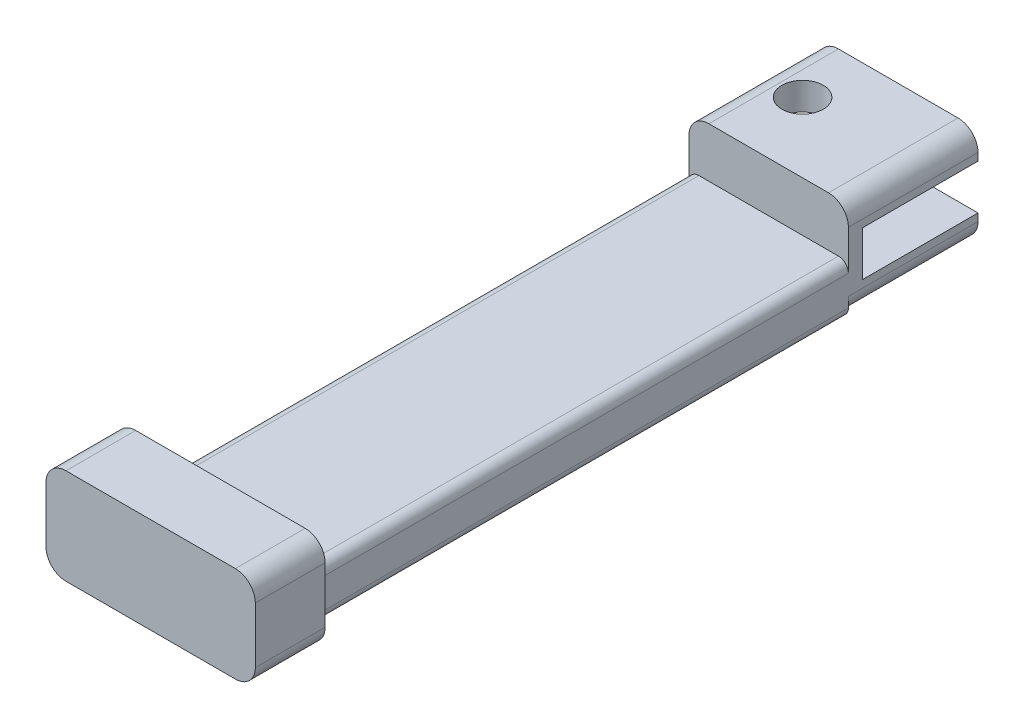
ISO-10303-21;
HEADER;
FILE_DESCRIPTION(('STEP AP214'),'2;1');
FILE_NAME('part.step','',(''),(''),'','','');
FILE_SCHEMA(('AUTOMOTIVE_DESIGN { 1 0 10303 214 1 1 1 1 }'));
ENDSEC;
DATA;
#1=APPLICATION_CONTEXT('core data for automotive mechanical design processes');
#2=APPLICATION_PROTOCOL_DEFINITION('international standard','automotive_design',2000,#1);
#3=PRODUCT_CONTEXT('',#1,'mechanical');
#4=PRODUCT('Part','Part','',(#3));
#5=PRODUCT_RELATED_PRODUCT_CATEGORY('part','',(#4));
#6=PRODUCT_DEFINITION_FORMATION('','',#4);
#7=PRODUCT_DEFINITION_CONTEXT('part definition',#1,'design');
#8=PRODUCT_DEFINITION('design','',#6,#7);
#9=PRODUCT_DEFINITION_SHAPE('','',#8);
#10=(LENGTH_UNIT() NAMED_UNIT(*) SI_UNIT(.MILLI.,.METRE.));
#11=(NAMED_UNIT(*) PLANE_ANGLE_UNIT() SI_UNIT($,.RADIAN.));
#12=(NAMED_UNIT(*) SI_UNIT($,.STERADIAN.) SOLID_ANGLE_UNIT());
#13=UNCERTAINTY_MEASURE_WITH_UNIT(LENGTH_MEASURE(1.E-05),#10,'distance_accuracy_value','');
#14=(GEOMETRIC_REPRESENTATION_CONTEXT(3) GLOBAL_UNCERTAINTY_ASSIGNED_CONTEXT((#13)) GLOBAL_UNIT_ASSIGNED_CONTEXT((#10,
#11,#12)) REPRESENTATION_CONTEXT('',''));
#15=CARTESIAN_POINT('',(0.,0.,0.));
#16=DIRECTION('',(0.,0.,1.));
#17=DIRECTION('',(1.,0.,0.));
#18=AXIS2_PLACEMENT_3D('',#15,#16,#17);
#19=CARTESIAN_POINT('',(8.,-4.,68.));
#20=DIRECTION('',(-1.,0.,0.));
#21=DIRECTION('',(0.,0.,1.));
#22=AXIS2_PLACEMENT_3D('',#19,#20,#21);
#23=PLANE('',#22);
#24=DIRECTION('',(0.,0.,-1.));
#25=VECTOR('',#24,1.);
#26=CARTESIAN_POINT('',(8.,-2.25,68.));
#27=LINE('',#26,#25);
#28=CARTESIAN_POINT('',(8.,-2.25,11.6));
#29=VERTEX_POINT('',#28);
#30=CARTESIAN_POINT('',(8.,-2.25,0.));
#31=VERTEX_POINT('',#30);
#32=EDGE_CURVE('E242',#29,#31,#27,.T.);
#33=ORIENTED_EDGE('',*,*,#32,.F.);
#34=DIRECTION('',(0.,1.,0.));
#35=VECTOR('',#34,1.);
#36=CARTESIAN_POINT('',(8.,-4.,11.6));
#37=LINE('',#36,#35);
#38=CARTESIAN_POINT('',(8.,2.25,11.6));
#39=VERTEX_POINT('',#38);
#40=EDGE_CURVE('E238',#29,#39,#37,.T.);
#41=ORIENTED_EDGE('',*,*,#40,.T.);
#42=DIRECTION('',(0.,0.,1.));
#43=VECTOR('',#42,1.);
#44=CARTESIAN_POINT('',(8.,2.25,68.));
#45=LINE('',#44,#43);
#46=CARTESIAN_POINT('',(8.,2.25,0.));
#47=VERTEX_POINT('',#46);
#48=EDGE_CURVE('E224',#47,#39,#45,.T.);
#49=ORIENTED_EDGE('',*,*,#48,.F.);
#50=DIRECTION('',(0.,1.,0.));
#51=VECTOR('',#50,1.);
#52=CARTESIAN_POINT('',(8.,-3.,0.));
#53=LINE('',#52,#51);
#54=CARTESIAN_POINT('',(8.,3.,0.));
#55=VERTEX_POINT('',#54);
#56=EDGE_CURVE('E332',#47,#55,#53,.T.);
#57=ORIENTED_EDGE('',*,*,#56,.T.);
#58=DIRECTION('',(0.,0.,-1.));
#59=VECTOR('',#58,1.);
#60=CARTESIAN_POINT('',(8.,3.,13.));
#61=LINE('',#60,#59);
#62=CARTESIAN_POINT('',(8.,3.,13.));
#63=VERTEX_POINT('',#62);
#64=EDGE_CURVE('E358',#63,#55,#61,.T.);
#65=ORIENTED_EDGE('',*,*,#64,.F.);
#66=DIRECTION('',(0.,1.,0.));
#67=VECTOR('',#66,1.);
#68=CARTESIAN_POINT('',(8.,-3.,13.));
#69=LINE('',#68,#67);
#70=CARTESIAN_POINT('',(8.,-1.,13.));
#71=VERTEX_POINT('',#70);
#72=EDGE_CURVE('E317',#71,#63,#69,.T.);
#73=ORIENTED_EDGE('',*,*,#72,.F.);
#74=DIRECTION('',(0.,0.,-1.));
#75=VECTOR('',#74,1.);
#76=CARTESIAN_POINT('',(8.,-1.,68.));
#77=LINE('',#76,#75);
#78=CARTESIAN_POINT('',(8.,-1.,68.));
#79=VERTEX_POINT('',#78);
#80=EDGE_CURVE('E422',#79,#71,#77,.T.);
#81=ORIENTED_EDGE('',*,*,#80,.F.);
#82=DIRECTION('',(0.,1.,0.));
#83=VECTOR('',#82,1.);
#84=CARTESIAN_POINT('',(8.,-4.,68.));
#85=LINE('',#84,#83);
#86=CARTESIAN_POINT('',(8.,-4.,68.));
#87=VERTEX_POINT('',#86);
#88=EDGE_CURVE('E372',#87,#79,#85,.T.);
#89=ORIENTED_EDGE('',*,*,#88,.F.);
#90=DIRECTION('',(0.,0.,-1.));
#91=VECTOR('',#90,1.);
#92=CARTESIAN_POINT('',(8.,-4.,68.));
#93=LINE('',#92,#91);
#94=CARTESIAN_POINT('',(8.,-4.,13.));
#95=VERTEX_POINT('',#94);
#96=EDGE_CURVE('E424',#87,#95,#93,.T.);
#97=ORIENTED_EDGE('',*,*,#96,.T.);
#98=DIRECTION('',(0.,1.,0.));
#99=VECTOR('',#98,1.);
#100=CARTESIAN_POINT('',(8.,-4.,13.));
#101=LINE('',#100,#99);
#102=CARTESIAN_POINT('',(8.,-3.,13.));
#103=VERTEX_POINT('',#102);
#104=EDGE_CURVE('E397',#95,#103,#101,.T.);
#105=ORIENTED_EDGE('',*,*,#104,.T.);
#106=DIRECTION('',(0.,0.,-1.));
#107=VECTOR('',#106,1.);
#108=CARTESIAN_POINT('',(8.,-3.,13.));
#109=LINE('',#108,#107);
#110=CARTESIAN_POINT('',(8.,-3.,0.));
#111=VERTEX_POINT('',#110);
#112=EDGE_CURVE('E64',#103,#111,#109,.T.);
#113=ORIENTED_EDGE('',*,*,#112,.T.);
#114=EDGE_CURVE('E333',#111,#31,#53,.T.);
#115=ORIENTED_EDGE('',*,*,#114,.T.);
#116=EDGE_LOOP('',(#33,#41,#49,#57,#65,#73,#81,#89,#97,#105,#113,#115));
#117=FACE_BOUND('',#116,.T.);
#118=ADVANCED_FACE('F39',(#117),#23,.F.);
#119=CARTESIAN_POINT('',(-8.,-1.,68.));
#120=DIRECTION('',(1.,0.,0.));
#121=DIRECTION('',(0.,0.,-1.));
#122=AXIS2_PLACEMENT_3D('',#119,#120,#121);
#123=PLANE('',#122);
#124=DIRECTION('',(0.,0.,1.));
#125=VECTOR('',#124,1.);
#126=CARTESIAN_POINT('',(-8.,-2.25,68.));
#127=LINE('',#126,#125);
#128=CARTESIAN_POINT('',(-8.,-2.25,0.));
#129=VERTEX_POINT('',#128);
#130=CARTESIAN_POINT('',(-8.,-2.25,11.6));
#131=VERTEX_POINT('',#130);
#132=EDGE_CURVE('E231',#129,#131,#127,.T.);
#133=ORIENTED_EDGE('',*,*,#132,.F.);
#134=DIRECTION('',(0.,-1.,0.));
#135=VECTOR('',#134,1.);
#136=CARTESIAN_POINT('',(-8.,3.,0.));
#137=LINE('',#136,#135);
#138=CARTESIAN_POINT('',(-8.,-3.,0.));
#139=VERTEX_POINT('',#138);
#140=EDGE_CURVE('E345',#129,#139,#137,.T.);
#141=ORIENTED_EDGE('',*,*,#140,.T.);
#142=DIRECTION('',(0.,0.,-1.));
#143=VECTOR('',#142,1.);
#144=CARTESIAN_POINT('',(-8.,-3.,13.));
#145=LINE('',#144,#143);
#146=CARTESIAN_POINT('',(-8.,-3.,13.));
#147=VERTEX_POINT('',#146);
#148=EDGE_CURVE('E328',#147,#139,#145,.T.);
#149=ORIENTED_EDGE('',*,*,#148,.F.);
#150=DIRECTION('',(0.,-1.,0.));
#151=VECTOR('',#150,1.);
#152=CARTESIAN_POINT('',(-8.,-1.,13.));
#153=LINE('',#152,#151);
#154=CARTESIAN_POINT('',(-8.,-4.,13.));
#155=VERTEX_POINT('',#154);
#156=EDGE_CURVE('E371',#147,#155,#153,.T.);
#157=ORIENTED_EDGE('',*,*,#156,.T.);
#158=DIRECTION('',(0.,0.,-1.));
#159=VECTOR('',#158,1.);
#160=CARTESIAN_POINT('',(-8.,-4.,68.));
#161=LINE('',#160,#159);
#162=CARTESIAN_POINT('',(-8.,-4.,68.));
#163=VERTEX_POINT('',#162);
#164=EDGE_CURVE('E386',#163,#155,#161,.T.);
#165=ORIENTED_EDGE('',*,*,#164,.F.);
#166=DIRECTION('',(0.,-1.,0.));
#167=VECTOR('',#166,1.);
#168=CARTESIAN_POINT('',(-8.,-1.,68.));
#169=LINE('',#168,#167);
#170=CARTESIAN_POINT('',(-8.,-1.,68.));
#171=VERTEX_POINT('',#170);
#172=EDGE_CURVE('E387',#171,#163,#169,.T.);
#173=ORIENTED_EDGE('',*,*,#172,.F.);
#174=DIRECTION('',(0.,0.,-1.));
#175=VECTOR('',#174,1.);
#176=CARTESIAN_POINT('',(-8.,-1.,68.));
#177=LINE('',#176,#175);
#178=CARTESIAN_POINT('',(-8.,-0.999999999999999,13.));
#179=VERTEX_POINT('',#178);
#180=EDGE_CURVE('E412',#171,#179,#177,.T.);
#181=ORIENTED_EDGE('',*,*,#180,.T.);
#182=DIRECTION('',(0.,-1.,0.));
#183=VECTOR('',#182,1.);
#184=CARTESIAN_POINT('',(-8.,3.,13.));
#185=LINE('',#184,#183);
#186=CARTESIAN_POINT('',(-8.,3.,13.));
#187=VERTEX_POINT('',#186);
#188=EDGE_CURVE('E321',#187,#179,#185,.T.);
#189=ORIENTED_EDGE('',*,*,#188,.F.);
#190=DIRECTION('',(0.,0.,-1.));
#191=VECTOR('',#190,1.);
#192=CARTESIAN_POINT('',(-8.,3.,13.));
#193=LINE('',#192,#191);
#194=CARTESIAN_POINT('',(-8.,3.,0.));
#195=VERTEX_POINT('',#194);
#196=EDGE_CURVE('E349',#187,#195,#193,.T.);
#197=ORIENTED_EDGE('',*,*,#196,.T.);
#198=CARTESIAN_POINT('',(-8.,2.25,0.));
#199=VERTEX_POINT('',#198);
#200=EDGE_CURVE('E313',#195,#199,#137,.T.);
#201=ORIENTED_EDGE('',*,*,#200,.T.);
#202=DIRECTION('',(0.,0.,-1.));
#203=VECTOR('',#202,1.);
#204=CARTESIAN_POINT('',(-8.,2.25,68.));
#205=LINE('',#204,#203);
#206=CARTESIAN_POINT('',(-8.,2.25,11.6));
#207=VERTEX_POINT('',#206);
#208=EDGE_CURVE('E54',#207,#199,#205,.T.);
#209=ORIENTED_EDGE('',*,*,#208,.F.);
#210=DIRECTION('',(0.,-1.,0.));
#211=VECTOR('',#210,1.);
#212=CARTESIAN_POINT('',(-8.,-1.,11.6));
#213=LINE('',#212,#211);
#214=EDGE_CURVE('E11',#207,#131,#213,.T.);
#215=ORIENTED_EDGE('',*,*,#214,.T.);
#216=EDGE_LOOP('',(#133,#141,#149,#157,#165,#173,#181,#189,#197,#201,#209,#215));
#217=FACE_BOUND('',#216,.T.);
#218=ADVANCED_FACE('F442',(#217),#123,.F.);
#219=CARTESIAN_POINT('',(-6.,-3.,0.));
#220=DIRECTION('',(0.,0.,1.));
#221=DIRECTION('',(1.,0.,0.));
#222=AXIS2_PLACEMENT_3D('',#219,#220,#221);
#223=PLANE('',#222);
#224=DIRECTION('',(-1.,0.,0.));
#225=VECTOR('',#224,1.);
#226=CARTESIAN_POINT('',(-6.,-2.25,0.));
#227=LINE('',#226,#225);
#228=EDGE_CURVE('E48',#31,#129,#227,.T.);
#229=ORIENTED_EDGE('',*,*,#228,.F.);
#230=ORIENTED_EDGE('',*,*,#114,.F.);
#231=CARTESIAN_POINT('',(6.,-3.,0.));
#232=DIRECTION('',(0.,0.,1.));
#233=DIRECTION('',(1.,0.,0.));
#234=AXIS2_PLACEMENT_3D('',#231,#232,#233);
#235=CIRCLE('',#234,2.);
#236=CARTESIAN_POINT('',(6.,-5.,0.));
#237=VERTEX_POINT('',#236);
#238=EDGE_CURVE('E331',#237,#111,#235,.T.);
#239=ORIENTED_EDGE('',*,*,#238,.F.);
#240=DIRECTION('',(1.,0.,0.));
#241=VECTOR('',#240,1.);
#242=CARTESIAN_POINT('',(-6.,-5.,0.));
#243=LINE('',#242,#241);
#244=CARTESIAN_POINT('',(-6.,-5.,0.));
#245=VERTEX_POINT('',#244);
#246=EDGE_CURVE('E330',#245,#237,#243,.T.);
#247=ORIENTED_EDGE('',*,*,#246,.F.);
#248=CARTESIAN_POINT('',(-6.,-3.,0.));
#249=DIRECTION('',(0.,0.,1.));
#250=DIRECTION('',(1.,0.,0.));
#251=AXIS2_PLACEMENT_3D('',#248,#249,#250);
#252=CIRCLE('',#251,2.);
#253=EDGE_CURVE('E307',#139,#245,#252,.T.);
#254=ORIENTED_EDGE('',*,*,#253,.F.);
#255=ORIENTED_EDGE('',*,*,#140,.F.);
#256=EDGE_LOOP('',(#229,#230,#239,#247,#254,#255));
#257=FACE_BOUND('',#256,.T.);
#258=ADVANCED_FACE('F444',(#257),#223,.F.);
#259=DIRECTION('',(1.,0.,0.));
#260=VECTOR('',#259,1.);
#261=CARTESIAN_POINT('',(-6.,2.25,0.));
#262=LINE('',#261,#260);
#263=EDGE_CURVE('E230',#199,#47,#262,.T.);
#264=ORIENTED_EDGE('',*,*,#263,.F.);
#265=ORIENTED_EDGE('',*,*,#200,.F.);
#266=CARTESIAN_POINT('',(-6.,3.,0.));
#267=DIRECTION('',(0.,0.,1.));
#268=DIRECTION('',(1.,0.,0.));
#269=AXIS2_PLACEMENT_3D('',#266,#267,#268);
#270=CIRCLE('',#269,2.);
#271=CARTESIAN_POINT('',(-6.,5.,0.));
#272=VERTEX_POINT('',#271);
#273=EDGE_CURVE('E338',#272,#195,#270,.T.);
#274=ORIENTED_EDGE('',*,*,#273,.F.);
#275=DIRECTION('',(-1.,0.,0.));
#276=VECTOR('',#275,1.);
#277=CARTESIAN_POINT('',(6.,5.,0.));
#278=LINE('',#277,#276);
#279=CARTESIAN_POINT('',(6.,5.,0.));
#280=VERTEX_POINT('',#279);
#281=EDGE_CURVE('E336',#280,#272,#278,.T.);
#282=ORIENTED_EDGE('',*,*,#281,.F.);
#283=CARTESIAN_POINT('',(6.,3.,0.));
#284=DIRECTION('',(0.,0.,1.));
#285=DIRECTION('',(1.,0.,0.));
#286=AXIS2_PLACEMENT_3D('',#283,#284,#285);
#287=CIRCLE('',#286,2.);
#288=EDGE_CURVE('E337',#55,#280,#287,.T.);
#289=ORIENTED_EDGE('',*,*,#288,.F.);
#290=ORIENTED_EDGE('',*,*,#56,.F.);
#291=EDGE_LOOP('',(#264,#265,#274,#282,#289,#290));
#292=FACE_BOUND('',#291,.T.);
#293=ADVANCED_FACE('F494',(#292),#223,.F.);
#294=CARTESIAN_POINT('',(-7.,-4.,13.));
#295=DIRECTION('',(0.,0.,1.));
#296=DIRECTION('',(1.,0.,0.));
#297=AXIS2_PLACEMENT_3D('',#294,#295,#296);
#298=PLANE('',#297);
#299=ORIENTED_EDGE('',*,*,#156,.F.);
#300=CARTESIAN_POINT('',(-6.,-3.,13.));
#301=DIRECTION('',(0.,0.,1.));
#302=DIRECTION('',(1.,0.,0.));
#303=AXIS2_PLACEMENT_3D('',#300,#301,#302);
#304=CIRCLE('',#303,2.);
#305=CARTESIAN_POINT('',(-6.,-5.,13.));
#306=VERTEX_POINT('',#305);
#307=EDGE_CURVE('E309',#147,#306,#304,.T.);
#308=ORIENTED_EDGE('',*,*,#307,.T.);
#309=DIRECTION('',(1.,0.,0.));
#310=VECTOR('',#309,1.);
#311=CARTESIAN_POINT('',(-7.,-5.,13.));
#312=LINE('',#311,#310);
#313=CARTESIAN_POINT('',(-7.,-5.,13.));
#314=VERTEX_POINT('',#313);
#315=EDGE_CURVE('E392',#314,#306,#312,.T.);
#316=ORIENTED_EDGE('',*,*,#315,.F.);
#317=CARTESIAN_POINT('',(-7.,-4.,13.));
#318=DIRECTION('',(0.,0.,1.));
#319=DIRECTION('',(1.,0.,0.));
#320=AXIS2_PLACEMENT_3D('',#317,#318,#319);
#321=CIRCLE('',#320,1.);
#322=EDGE_CURVE('E366',#155,#314,#321,.T.);
#323=ORIENTED_EDGE('',*,*,#322,.F.);
#324=EDGE_LOOP('',(#299,#308,#316,#323));
#325=FACE_BOUND('',#324,.T.);
#326=ADVANCED_FACE('F458',(#325),#298,.F.);
#327=CARTESIAN_POINT('',(-7.,-4.,68.));
#328=DIRECTION('',(0.,0.,-1.));
#329=DIRECTION('',(-1.,0.,0.));
#330=AXIS2_PLACEMENT_3D('',#327,#328,#329);
#331=CYLINDRICAL_SURFACE('',#330,1.);
#332=ORIENTED_EDGE('',*,*,#322,.T.);
#333=DIRECTION('',(0.,0.,-1.));
#334=VECTOR('',#333,1.);
#335=CARTESIAN_POINT('',(-7.,-5.,68.));
#336=LINE('',#335,#334);
#337=CARTESIAN_POINT('',(-7.,-5.,68.));
#338=VERTEX_POINT('',#337);
#339=EDGE_CURVE('E431',#338,#314,#336,.T.);
#340=ORIENTED_EDGE('',*,*,#339,.F.);
#341=CARTESIAN_POINT('',(-7.,-4.,68.));
#342=DIRECTION('',(0.,0.,1.));
#343=DIRECTION('',(1.,0.,0.));
#344=AXIS2_PLACEMENT_3D('',#341,#342,#343);
#345=CIRCLE('',#344,1.);
#346=EDGE_CURVE('E370',#163,#338,#345,.T.);
#347=ORIENTED_EDGE('',*,*,#346,.F.);
#348=ORIENTED_EDGE('',*,*,#164,.T.);
#349=EDGE_LOOP('',(#332,#340,#347,#348));
#350=FACE_BOUND('',#349,.T.);
#351=ADVANCED_FACE('F41',(#350),#331,.T.);
#352=CARTESIAN_POINT('',(-7.,-5.,68.));
#353=DIRECTION('',(0.,1.,0.));
#354=DIRECTION('',(0.,0.,1.));
#355=AXIS2_PLACEMENT_3D('',#352,#353,#354);
#356=PLANE('',#355);
#357=CARTESIAN_POINT('',(-3.6,-5.,6.));
#358=DIRECTION('',(0.,1.,0.));
#359=DIRECTION('',(0.,0.,1.));
#360=AXIS2_PLACEMENT_3D('',#357,#358,#359);
#361=CIRCLE('',#360,2.08);
#362=CARTESIAN_POINT('',(-3.6,-5.,8.08));
#363=VERTEX_POINT('',#362);
#364=EDGE_CURVE('E530',#363,#363,#361,.F.);
#365=ORIENTED_EDGE('',*,*,#364,.F.);
#366=EDGE_LOOP('',(#365));
#367=FACE_BOUND('',#366,.T.);
#368=ORIENTED_EDGE('',*,*,#315,.T.);
#369=DIRECTION('',(0.,0.,-1.));
#370=VECTOR('',#369,1.);
#371=CARTESIAN_POINT('',(-6.,-5.,13.));
#372=LINE('',#371,#370);
#373=EDGE_CURVE('E361',#306,#245,#372,.T.);
#374=ORIENTED_EDGE('',*,*,#373,.T.);
#375=ORIENTED_EDGE('',*,*,#246,.T.);
#376=DIRECTION('',(0.,0.,-1.));
#377=VECTOR('',#376,1.);
#378=CARTESIAN_POINT('',(6.,-5.,13.));
#379=LINE('',#378,#377);
#380=CARTESIAN_POINT('',(6.,-5.,13.));
#381=VERTEX_POINT('',#380);
#382=EDGE_CURVE('E359',#381,#237,#379,.T.);
#383=ORIENTED_EDGE('',*,*,#382,.F.);
#384=CARTESIAN_POINT('',(7.,-5.,13.));
#385=VERTEX_POINT('',#384);
#386=EDGE_CURVE('E394',#381,#385,#312,.T.);
#387=ORIENTED_EDGE('',*,*,#386,.T.);
#388=DIRECTION('',(0.,0.,-1.));
#389=VECTOR('',#388,1.);
#390=CARTESIAN_POINT('',(7.,-5.,68.));
#391=LINE('',#390,#389);
#392=CARTESIAN_POINT('',(7.,-5.,68.));
#393=VERTEX_POINT('',#392);
#394=EDGE_CURVE('E426',#393,#385,#391,.T.);
#395=ORIENTED_EDGE('',*,*,#394,.F.);
#396=DIRECTION('',(1.,0.,0.));
#397=VECTOR('',#396,1.);
#398=CARTESIAN_POINT('',(-8.5,-5.,68.));
#399=LINE('',#398,#397);
#400=CARTESIAN_POINT('',(8.5,-5.,68.));
#401=VERTEX_POINT('',#400);
#402=EDGE_CURVE('E247',#393,#401,#399,.T.);
#403=ORIENTED_EDGE('',*,*,#402,.T.);
#404=DIRECTION('',(0.,0.,-1.));
#405=VECTOR('',#404,1.);
#406=CARTESIAN_POINT('',(8.5,-5.,75.));
#407=LINE('',#406,#405);
#408=CARTESIAN_POINT('',(8.5,-5.,75.));
#409=VERTEX_POINT('',#408);
#410=EDGE_CURVE('E303',#409,#401,#407,.T.);
#411=ORIENTED_EDGE('',*,*,#410,.F.);
#412=DIRECTION('',(1.,0.,0.));
#413=VECTOR('',#412,1.);
#414=CARTESIAN_POINT('',(-8.5,-5.,75.));
#415=LINE('',#414,#413);
#416=CARTESIAN_POINT('',(-8.5,-5.,75.));
#417=VERTEX_POINT('',#416);
#418=EDGE_CURVE('E257',#417,#409,#415,.T.);
#419=ORIENTED_EDGE('',*,*,#418,.F.);
#420=DIRECTION('',(0.,0.,-1.));
#421=VECTOR('',#420,1.);
#422=CARTESIAN_POINT('',(-8.5,-5.,75.));
#423=LINE('',#422,#421);
#424=CARTESIAN_POINT('',(-8.5,-5.,68.));
#425=VERTEX_POINT('',#424);
#426=EDGE_CURVE('E306',#417,#425,#423,.T.);
#427=ORIENTED_EDGE('',*,*,#426,.T.);
#428=EDGE_CURVE('E275',#425,#338,#399,.T.);
#429=ORIENTED_EDGE('',*,*,#428,.T.);
#430=ORIENTED_EDGE('',*,*,#339,.T.);
#431=EDGE_LOOP('',(#368,#374,#375,#383,#387,#395,#403,#411,#419,#427,#429,#430));
#432=FACE_BOUND('',#431,.T.);
#433=ADVANCED_FACE('F457',(#367,#432),#356,.F.);
#434=CARTESIAN_POINT('',(7.,-4.,68.));
#435=DIRECTION('',(0.,0.,-1.));
#436=DIRECTION('',(-1.,0.,0.));
#437=AXIS2_PLACEMENT_3D('',#434,#435,#436);
#438=CYLINDRICAL_SURFACE('',#437,1.);
#439=CARTESIAN_POINT('',(7.,-4.,13.));
#440=DIRECTION('',(0.,0.,1.));
#441=DIRECTION('',(1.,0.,0.));
#442=AXIS2_PLACEMENT_3D('',#439,#440,#441);
#443=CIRCLE('',#442,1.);
#444=EDGE_CURVE('E396',#385,#95,#443,.T.);
#445=ORIENTED_EDGE('',*,*,#444,.T.);
#446=ORIENTED_EDGE('',*,*,#96,.F.);
#447=CARTESIAN_POINT('',(7.,-4.,68.));
#448=DIRECTION('',(0.,0.,1.));
#449=DIRECTION('',(1.,0.,0.));
#450=AXIS2_PLACEMENT_3D('',#447,#448,#449);
#451=CIRCLE('',#450,1.);
#452=EDGE_CURVE('E369',#393,#87,#451,.T.);
#453=ORIENTED_EDGE('',*,*,#452,.F.);
#454=ORIENTED_EDGE('',*,*,#394,.T.);
#455=EDGE_LOOP('',(#445,#446,#453,#454));
#456=FACE_BOUND('',#455,.T.);
#457=ADVANCED_FACE('F517',(#456),#438,.T.);
#458=CARTESIAN_POINT('',(7.,-1.,68.));
#459=DIRECTION('',(0.,0.,-1.));
#460=DIRECTION('',(-1.,0.,0.));
#461=AXIS2_PLACEMENT_3D('',#458,#459,#460);
#462=CYLINDRICAL_SURFACE('',#461,0.999999999999999);
#463=CARTESIAN_POINT('',(7.,-1.,13.));
#464=DIRECTION('',(0.,0.,1.));
#465=DIRECTION('',(1.,0.,0.));
#466=AXIS2_PLACEMENT_3D('',#463,#464,#465);
#467=CIRCLE('',#466,0.999999999999999);
#468=CARTESIAN_POINT('',(7.,0.,13.));
#469=VERTEX_POINT('',#468);
#470=EDGE_CURVE('E402',#71,#469,#467,.T.);
#471=ORIENTED_EDGE('',*,*,#470,.T.);
#472=DIRECTION('',(0.,0.,-1.));
#473=VECTOR('',#472,1.);
#474=CARTESIAN_POINT('',(7.,0.,68.));
#475=LINE('',#474,#473);
#476=CARTESIAN_POINT('',(7.,0.,68.));
#477=VERTEX_POINT('',#476);
#478=EDGE_CURVE('E418',#477,#469,#475,.T.);
#479=ORIENTED_EDGE('',*,*,#478,.F.);
#480=CARTESIAN_POINT('',(7.,-1.,68.));
#481=DIRECTION('',(0.,0.,1.));
#482=DIRECTION('',(1.,0.,0.));
#483=AXIS2_PLACEMENT_3D('',#480,#481,#482);
#484=CIRCLE('',#483,0.999999999999999);
#485=EDGE_CURVE('E380',#79,#477,#484,.T.);
#486=ORIENTED_EDGE('',*,*,#485,.F.);
#487=ORIENTED_EDGE('',*,*,#80,.T.);
#488=EDGE_LOOP('',(#471,#479,#486,#487));
#489=FACE_BOUND('',#488,.T.);
#490=ADVANCED_FACE('F474',(#489),#462,.T.);
#491=CARTESIAN_POINT('',(7.,0.,68.));
#492=DIRECTION('',(0.,-1.,0.));
#493=DIRECTION('',(0.,0.,-1.));
#494=AXIS2_PLACEMENT_3D('',#491,#492,#493);
#495=PLANE('',#494);
#496=DIRECTION('',(-1.,0.,0.));
#497=VECTOR('',#496,1.);
#498=CARTESIAN_POINT('',(7.,0.,13.));
#499=LINE('',#498,#497);
#500=CARTESIAN_POINT('',(-7.,0.,13.));
#501=VERTEX_POINT('',#500);
#502=EDGE_CURVE('E404',#469,#501,#499,.T.);
#503=ORIENTED_EDGE('',*,*,#502,.T.);
#504=DIRECTION('',(0.,0.,-1.));
#505=VECTOR('',#504,1.);
#506=CARTESIAN_POINT('',(-7.,0.,68.));
#507=LINE('',#506,#505);
#508=CARTESIAN_POINT('',(-7.,0.,68.));
#509=VERTEX_POINT('',#508);
#510=EDGE_CURVE('E416',#509,#501,#507,.T.);
#511=ORIENTED_EDGE('',*,*,#510,.F.);
#512=DIRECTION('',(-1.,0.,0.));
#513=VECTOR('',#512,1.);
#514=CARTESIAN_POINT('',(7.,0.,68.));
#515=LINE('',#514,#513);
#516=EDGE_CURVE('E379',#477,#509,#515,.T.);
#517=ORIENTED_EDGE('',*,*,#516,.F.);
#518=ORIENTED_EDGE('',*,*,#478,.T.);
#519=EDGE_LOOP('',(#503,#511,#517,#518));
#520=FACE_BOUND('',#519,.T.);
#521=ADVANCED_FACE('F469',(#520),#495,.F.);
#522=CARTESIAN_POINT('',(-7.,-0.999999999999999,68.));
#523=DIRECTION('',(0.,0.,-1.));
#524=DIRECTION('',(-1.,0.,0.));
#525=AXIS2_PLACEMENT_3D('',#522,#523,#524);
#526=CYLINDRICAL_SURFACE('',#525,1.);
#527=CARTESIAN_POINT('',(-7.,-0.999999999999999,13.));
#528=DIRECTION('',(0.,0.,1.));
#529=DIRECTION('',(1.,0.,0.));
#530=AXIS2_PLACEMENT_3D('',#527,#528,#529);
#531=CIRCLE('',#530,1.);
#532=EDGE_CURVE('E410',#501,#179,#531,.T.);
#533=ORIENTED_EDGE('',*,*,#532,.T.);
#534=ORIENTED_EDGE('',*,*,#180,.F.);
#535=CARTESIAN_POINT('',(-7.,-0.999999999999999,68.));
#536=DIRECTION('',(0.,0.,1.));
#537=DIRECTION('',(1.,0.,0.));
#538=AXIS2_PLACEMENT_3D('',#535,#536,#537);
#539=CIRCLE('',#538,1.);
#540=EDGE_CURVE('E384',#509,#171,#539,.T.);
#541=ORIENTED_EDGE('',*,*,#540,.F.);
#542=ORIENTED_EDGE('',*,*,#510,.T.);
#543=EDGE_LOOP('',(#533,#534,#541,#542));
#544=FACE_BOUND('',#543,.T.);
#545=ADVANCED_FACE('F464',(#544),#526,.T.);
#546=ORIENTED_EDGE('',*,*,#386,.F.);
#547=CARTESIAN_POINT('',(6.,-3.,13.));
#548=DIRECTION('',(0.,0.,1.));
#549=DIRECTION('',(1.,0.,0.));
#550=AXIS2_PLACEMENT_3D('',#547,#548,#549);
#551=CIRCLE('',#550,2.);
#552=EDGE_CURVE('E312',#381,#103,#551,.T.);
#553=ORIENTED_EDGE('',*,*,#552,.T.);
#554=ORIENTED_EDGE('',*,*,#104,.F.);
#555=ORIENTED_EDGE('',*,*,#444,.F.);
#556=EDGE_LOOP('',(#546,#553,#554,#555));
#557=FACE_BOUND('',#556,.T.);
#558=ADVANCED_FACE('F503',(#557),#298,.F.);
#559=CARTESIAN_POINT('',(-6.,-3.,13.));
#560=DIRECTION('',(0.,0.,1.));
#561=DIRECTION('',(1.,0.,0.));
#562=AXIS2_PLACEMENT_3D('',#559,#560,#561);
#563=PLANE('',#562);
#564=ORIENTED_EDGE('',*,*,#532,.F.);
#565=ORIENTED_EDGE('',*,*,#502,.F.);
#566=ORIENTED_EDGE('',*,*,#470,.F.);
#567=ORIENTED_EDGE('',*,*,#72,.T.);
#568=CARTESIAN_POINT('',(6.,3.,13.));
#569=DIRECTION('',(0.,0.,1.));
#570=DIRECTION('',(1.,0.,0.));
#571=AXIS2_PLACEMENT_3D('',#568,#569,#570);
#572=CIRCLE('',#571,2.);
#573=CARTESIAN_POINT('',(6.,5.,13.));
#574=VERTEX_POINT('',#573);
#575=EDGE_CURVE('E319',#63,#574,#572,.T.);
#576=ORIENTED_EDGE('',*,*,#575,.T.);
#577=DIRECTION('',(-1.,0.,0.));
#578=VECTOR('',#577,1.);
#579=CARTESIAN_POINT('',(6.,5.,13.));
#580=LINE('',#579,#578);
#581=CARTESIAN_POINT('',(-6.,5.,13.));
#582=VERTEX_POINT('',#581);
#583=EDGE_CURVE('E318',#574,#582,#580,.T.);
#584=ORIENTED_EDGE('',*,*,#583,.T.);
#585=CARTESIAN_POINT('',(-6.,3.,13.));
#586=DIRECTION('',(0.,0.,1.));
#587=DIRECTION('',(1.,0.,0.));
#588=AXIS2_PLACEMENT_3D('',#585,#586,#587);
#589=CIRCLE('',#588,2.);
#590=EDGE_CURVE('E325',#582,#187,#589,.T.);
#591=ORIENTED_EDGE('',*,*,#590,.T.);
#592=ORIENTED_EDGE('',*,*,#188,.T.);
#593=EDGE_LOOP('',(#564,#565,#566,#567,#576,#584,#591,#592));
#594=FACE_BOUND('',#593,.T.);
#595=ADVANCED_FACE('F470',(#594),#563,.T.);
#596=CARTESIAN_POINT('',(-6.,-3.,13.));
#597=DIRECTION('',(0.,0.,-1.));
#598=DIRECTION('',(-1.,0.,0.));
#599=AXIS2_PLACEMENT_3D('',#596,#597,#598);
#600=CYLINDRICAL_SURFACE('',#599,2.);
#601=ORIENTED_EDGE('',*,*,#253,.T.);
#602=ORIENTED_EDGE('',*,*,#373,.F.);
#603=ORIENTED_EDGE('',*,*,#307,.F.);
#604=ORIENTED_EDGE('',*,*,#148,.T.);
#605=EDGE_LOOP('',(#601,#602,#603,#604));
#606=FACE_BOUND('',#605,.T.);
#607=ADVANCED_FACE('F449',(#606),#600,.T.);
#608=CARTESIAN_POINT('',(6.,-3.,13.));
#609=DIRECTION('',(0.,0.,-1.));
#610=DIRECTION('',(-1.,0.,0.));
#611=AXIS2_PLACEMENT_3D('',#608,#609,#610);
#612=CYLINDRICAL_SURFACE('',#611,2.);
#613=ORIENTED_EDGE('',*,*,#238,.T.);
#614=ORIENTED_EDGE('',*,*,#112,.F.);
#615=ORIENTED_EDGE('',*,*,#552,.F.);
#616=ORIENTED_EDGE('',*,*,#382,.T.);
#617=EDGE_LOOP('',(#613,#614,#615,#616));
#618=FACE_BOUND('',#617,.T.);
#619=ADVANCED_FACE('F560',(#618),#612,.T.);
#620=CARTESIAN_POINT('',(6.,3.,13.));
#621=DIRECTION('',(0.,0.,-1.));
#622=DIRECTION('',(-1.,0.,0.));
#623=AXIS2_PLACEMENT_3D('',#620,#621,#622);
#624=CYLINDRICAL_SURFACE('',#623,2.);
#625=ORIENTED_EDGE('',*,*,#288,.T.);
#626=DIRECTION('',(0.,0.,-1.));
#627=VECTOR('',#626,1.);
#628=CARTESIAN_POINT('',(6.,5.,13.));
#629=LINE('',#628,#627);
#630=EDGE_CURVE('E352',#574,#280,#629,.T.);
#631=ORIENTED_EDGE('',*,*,#630,.F.);
#632=ORIENTED_EDGE('',*,*,#575,.F.);
#633=ORIENTED_EDGE('',*,*,#64,.T.);
#634=EDGE_LOOP('',(#625,#631,#632,#633));
#635=FACE_BOUND('',#634,.T.);
#636=ADVANCED_FACE('F481',(#635),#624,.T.);
#637=CARTESIAN_POINT('',(6.,5.,13.));
#638=DIRECTION('',(0.,-1.,0.));
#639=DIRECTION('',(0.,0.,-1.));
#640=AXIS2_PLACEMENT_3D('',#637,#638,#639);
#641=PLANE('',#640);
#642=CARTESIAN_POINT('',(-3.6,5.,6.));
#643=DIRECTION('',(0.,-1.,0.));
#644=DIRECTION('',(0.,0.,-1.));
#645=AXIS2_PLACEMENT_3D('',#642,#643,#644);
#646=CIRCLE('',#645,2.08);
#647=CARTESIAN_POINT('',(-3.6,5.,3.92));
#648=VERTEX_POINT('',#647);
#649=EDGE_CURVE('E528',#648,#648,#646,.F.);
#650=ORIENTED_EDGE('',*,*,#649,.F.);
#651=EDGE_LOOP('',(#650));
#652=FACE_BOUND('',#651,.T.);
#653=ORIENTED_EDGE('',*,*,#281,.T.);
#654=DIRECTION('',(0.,0.,-1.));
#655=VECTOR('',#654,1.);
#656=CARTESIAN_POINT('',(-6.,5.,13.));
#657=LINE('',#656,#655);
#658=EDGE_CURVE('E346',#582,#272,#657,.T.);
#659=ORIENTED_EDGE('',*,*,#658,.F.);
#660=ORIENTED_EDGE('',*,*,#583,.F.);
#661=ORIENTED_EDGE('',*,*,#630,.T.);
#662=EDGE_LOOP('',(#653,#659,#660,#661));
#663=FACE_BOUND('',#662,.T.);
#664=ADVANCED_FACE('F487',(#652,#663),#641,.F.);
#665=CARTESIAN_POINT('',(-6.,3.,13.));
#666=DIRECTION('',(0.,0.,-1.));
#667=DIRECTION('',(-1.,0.,0.));
#668=AXIS2_PLACEMENT_3D('',#665,#666,#667);
#669=CYLINDRICAL_SURFACE('',#668,2.);
#670=ORIENTED_EDGE('',*,*,#273,.T.);
#671=ORIENTED_EDGE('',*,*,#196,.F.);
#672=ORIENTED_EDGE('',*,*,#590,.F.);
#673=ORIENTED_EDGE('',*,*,#658,.T.);
#674=EDGE_LOOP('',(#670,#671,#672,#673));
#675=FACE_BOUND('',#674,.T.);
#676=ADVANCED_FACE('F493',(#675),#669,.T.);
#677=CARTESIAN_POINT('',(-8.5,-3.,68.));
#678=DIRECTION('',(0.,0.,1.));
#679=DIRECTION('',(1.,0.,0.));
#680=AXIS2_PLACEMENT_3D('',#677,#678,#679);
#681=PLANE('',#680);
#682=ORIENTED_EDGE('',*,*,#172,.T.);
#683=ORIENTED_EDGE('',*,*,#346,.T.);
#684=ORIENTED_EDGE('',*,*,#428,.F.);
#685=CARTESIAN_POINT('',(-8.5,-3.,68.));
#686=DIRECTION('',(0.,0.,1.));
#687=DIRECTION('',(1.,0.,0.));
#688=AXIS2_PLACEMENT_3D('',#685,#686,#687);
#689=CIRCLE('',#688,2.);
#690=CARTESIAN_POINT('',(-10.5,-3.,68.));
#691=VERTEX_POINT('',#690);
#692=EDGE_CURVE('E244',#691,#425,#689,.T.);
#693=ORIENTED_EDGE('',*,*,#692,.F.);
#694=DIRECTION('',(0.,-1.,0.));
#695=VECTOR('',#694,1.);
#696=CARTESIAN_POINT('',(-10.5,2.6,68.));
#697=LINE('',#696,#695);
#698=CARTESIAN_POINT('',(-10.5,2.6,68.));
#699=VERTEX_POINT('',#698);
#700=EDGE_CURVE('E260',#699,#691,#697,.T.);
#701=ORIENTED_EDGE('',*,*,#700,.F.);
#702=CARTESIAN_POINT('',(-8.5,2.6,68.));
#703=DIRECTION('',(0.,0.,1.));
#704=DIRECTION('',(1.,0.,0.));
#705=AXIS2_PLACEMENT_3D('',#702,#703,#704);
#706=CIRCLE('',#705,2.);
#707=CARTESIAN_POINT('',(-8.5,4.6,68.));
#708=VERTEX_POINT('',#707);
#709=EDGE_CURVE('E282',#708,#699,#706,.T.);
#710=ORIENTED_EDGE('',*,*,#709,.F.);
#711=DIRECTION('',(-1.,0.,0.));
#712=VECTOR('',#711,1.);
#713=CARTESIAN_POINT('',(8.5,4.6,68.));
#714=LINE('',#713,#712);
#715=CARTESIAN_POINT('',(8.5,4.6,68.));
#716=VERTEX_POINT('',#715);
#717=EDGE_CURVE('E283',#716,#708,#714,.T.);
#718=ORIENTED_EDGE('',*,*,#717,.F.);
#719=CARTESIAN_POINT('',(8.5,2.6,68.));
#720=DIRECTION('',(0.,0.,1.));
#721=DIRECTION('',(1.,0.,0.));
#722=AXIS2_PLACEMENT_3D('',#719,#720,#721);
#723=CIRCLE('',#722,2.);
#724=CARTESIAN_POINT('',(10.5,2.6,68.));
#725=VERTEX_POINT('',#724);
#726=EDGE_CURVE('E276',#725,#716,#723,.T.);
#727=ORIENTED_EDGE('',*,*,#726,.F.);
#728=DIRECTION('',(0.,1.,0.));
#729=VECTOR('',#728,1.);
#730=CARTESIAN_POINT('',(10.5,-3.,68.));
#731=LINE('',#730,#729);
#732=CARTESIAN_POINT('',(10.5,-3.,68.));
#733=VERTEX_POINT('',#732);
#734=EDGE_CURVE('E280',#733,#725,#731,.T.);
#735=ORIENTED_EDGE('',*,*,#734,.F.);
#736=CARTESIAN_POINT('',(8.5,-3.,68.));
#737=DIRECTION('',(0.,0.,1.));
#738=DIRECTION('',(1.,0.,0.));
#739=AXIS2_PLACEMENT_3D('',#736,#737,#738);
#740=CIRCLE('',#739,2.);
#741=EDGE_CURVE('E273',#401,#733,#740,.T.);
#742=ORIENTED_EDGE('',*,*,#741,.F.);
#743=ORIENTED_EDGE('',*,*,#402,.F.);
#744=ORIENTED_EDGE('',*,*,#452,.T.);
#745=ORIENTED_EDGE('',*,*,#88,.T.);
#746=ORIENTED_EDGE('',*,*,#485,.T.);
#747=ORIENTED_EDGE('',*,*,#516,.T.);
#748=ORIENTED_EDGE('',*,*,#540,.T.);
#749=EDGE_LOOP('',(#682,#683,#684,#693,#701,#710,#718,#727,#735,#742,#743,#744,#745,#746,#747,#748));
#750=FACE_BOUND('',#749,.T.);
#751=ADVANCED_FACE('F456',(#750),#681,.F.);
#752=CARTESIAN_POINT('',(-8.5,-3.,75.));
#753=DIRECTION('',(0.,0.,-1.));
#754=DIRECTION('',(-1.,0.,0.));
#755=AXIS2_PLACEMENT_3D('',#752,#753,#754);
#756=CYLINDRICAL_SURFACE('',#755,2.);
#757=ORIENTED_EDGE('',*,*,#692,.T.);
#758=ORIENTED_EDGE('',*,*,#426,.F.);
#759=CARTESIAN_POINT('',(-8.5,-3.,75.));
#760=DIRECTION('',(0.,0.,1.));
#761=DIRECTION('',(1.,0.,0.));
#762=AXIS2_PLACEMENT_3D('',#759,#760,#761);
#763=CIRCLE('',#762,2.);
#764=CARTESIAN_POINT('',(-10.5,-3.,75.));
#765=VERTEX_POINT('',#764);
#766=EDGE_CURVE('E254',#765,#417,#763,.T.);
#767=ORIENTED_EDGE('',*,*,#766,.F.);
#768=DIRECTION('',(0.,0.,-1.));
#769=VECTOR('',#768,1.);
#770=CARTESIAN_POINT('',(-10.5,-3.,75.));
#771=LINE('',#770,#769);
#772=EDGE_CURVE('E269',#765,#691,#771,.T.);
#773=ORIENTED_EDGE('',*,*,#772,.T.);
#774=EDGE_LOOP('',(#757,#758,#767,#773));
#775=FACE_BOUND('',#774,.T.);
#776=ADVANCED_FACE('F645',(#775),#756,.T.);
#777=CARTESIAN_POINT('',(8.5,-3.,75.));
#778=DIRECTION('',(0.,0.,-1.));
#779=DIRECTION('',(-1.,0.,0.));
#780=AXIS2_PLACEMENT_3D('',#777,#778,#779);
#781=CYLINDRICAL_SURFACE('',#780,2.);
#782=ORIENTED_EDGE('',*,*,#741,.T.);
#783=DIRECTION('',(0.,0.,-1.));
#784=VECTOR('',#783,1.);
#785=CARTESIAN_POINT('',(10.5,-3.,75.));
#786=LINE('',#785,#784);
#787=CARTESIAN_POINT('',(10.5,-3.,75.));
#788=VERTEX_POINT('',#787);
#789=EDGE_CURVE('E297',#788,#733,#786,.T.);
#790=ORIENTED_EDGE('',*,*,#789,.F.);
#791=CARTESIAN_POINT('',(8.5,-3.,75.));
#792=DIRECTION('',(0.,0.,1.));
#793=DIRECTION('',(1.,0.,0.));
#794=AXIS2_PLACEMENT_3D('',#791,#792,#793);
#795=CIRCLE('',#794,2.);
#796=EDGE_CURVE('E256',#409,#788,#795,.T.);
#797=ORIENTED_EDGE('',*,*,#796,.F.);
#798=ORIENTED_EDGE('',*,*,#410,.T.);
#799=EDGE_LOOP('',(#782,#790,#797,#798));
#800=FACE_BOUND('',#799,.T.);
#801=ADVANCED_FACE('F648',(#800),#781,.T.);
#802=CARTESIAN_POINT('',(10.5,-3.,75.));
#803=DIRECTION('',(-1.,0.,0.));
#804=DIRECTION('',(0.,0.,1.));
#805=AXIS2_PLACEMENT_3D('',#802,#803,#804);
#806=PLANE('',#805);
#807=ORIENTED_EDGE('',*,*,#734,.T.);
#808=DIRECTION('',(0.,0.,-1.));
#809=VECTOR('',#808,1.);
#810=CARTESIAN_POINT('',(10.5,2.6,75.));
#811=LINE('',#810,#809);
#812=CARTESIAN_POINT('',(10.5,2.6,75.));
#813=VERTEX_POINT('',#812);
#814=EDGE_CURVE('E300',#813,#725,#811,.T.);
#815=ORIENTED_EDGE('',*,*,#814,.F.);
#816=DIRECTION('',(0.,1.,0.));
#817=VECTOR('',#816,1.);
#818=CARTESIAN_POINT('',(10.5,-3.,75.));
#819=LINE('',#818,#817);
#820=EDGE_CURVE('E263',#788,#813,#819,.T.);
#821=ORIENTED_EDGE('',*,*,#820,.F.);
#822=ORIENTED_EDGE('',*,*,#789,.T.);
#823=EDGE_LOOP('',(#807,#815,#821,#822));
#824=FACE_BOUND('',#823,.T.);
#825=ADVANCED_FACE('F658',(#824),#806,.F.);
#826=CARTESIAN_POINT('',(8.5,2.6,75.));
#827=DIRECTION('',(0.,0.,-1.));
#828=DIRECTION('',(-1.,0.,0.));
#829=AXIS2_PLACEMENT_3D('',#826,#827,#828);
#830=CYLINDRICAL_SURFACE('',#829,2.);
#831=ORIENTED_EDGE('',*,*,#726,.T.);
#832=DIRECTION('',(0.,0.,-1.));
#833=VECTOR('',#832,1.);
#834=CARTESIAN_POINT('',(8.5,4.6,75.));
#835=LINE('',#834,#833);
#836=CARTESIAN_POINT('',(8.5,4.6,75.));
#837=VERTEX_POINT('',#836);
#838=EDGE_CURVE('E295',#837,#716,#835,.T.);
#839=ORIENTED_EDGE('',*,*,#838,.F.);
#840=CARTESIAN_POINT('',(8.5,2.6,75.));
#841=DIRECTION('',(0.,0.,1.));
#842=DIRECTION('',(1.,0.,0.));
#843=AXIS2_PLACEMENT_3D('',#840,#841,#842);
#844=CIRCLE('',#843,2.);
#845=EDGE_CURVE('E262',#813,#837,#844,.T.);
#846=ORIENTED_EDGE('',*,*,#845,.F.);
#847=ORIENTED_EDGE('',*,*,#814,.T.);
#848=EDGE_LOOP('',(#831,#839,#846,#847));
#849=FACE_BOUND('',#848,.T.);
#850=ADVANCED_FACE('F669',(#849),#830,.T.);
#851=CARTESIAN_POINT('',(8.5,4.6,75.));
#852=DIRECTION('',(0.,-1.,0.));
#853=DIRECTION('',(0.,0.,-1.));
#854=AXIS2_PLACEMENT_3D('',#851,#852,#853);
#855=PLANE('',#854);
#856=ORIENTED_EDGE('',*,*,#717,.T.);
#857=DIRECTION('',(0.,0.,-1.));
#858=VECTOR('',#857,1.);
#859=CARTESIAN_POINT('',(-8.5,4.6,75.));
#860=LINE('',#859,#858);
#861=CARTESIAN_POINT('',(-8.5,4.6,75.));
#862=VERTEX_POINT('',#861);
#863=EDGE_CURVE('E293',#862,#708,#860,.T.);
#864=ORIENTED_EDGE('',*,*,#863,.F.);
#865=DIRECTION('',(-1.,0.,0.));
#866=VECTOR('',#865,1.);
#867=CARTESIAN_POINT('',(8.5,4.6,75.));
#868=LINE('',#867,#866);
#869=EDGE_CURVE('E261',#837,#862,#868,.T.);
#870=ORIENTED_EDGE('',*,*,#869,.F.);
#871=ORIENTED_EDGE('',*,*,#838,.T.);
#872=EDGE_LOOP('',(#856,#864,#870,#871));
#873=FACE_BOUND('',#872,.T.);
#874=ADVANCED_FACE('F680',(#873),#855,.F.);
#875=CARTESIAN_POINT('',(-8.5,2.6,75.));
#876=DIRECTION('',(0.,0.,-1.));
#877=DIRECTION('',(-1.,0.,0.));
#878=AXIS2_PLACEMENT_3D('',#875,#876,#877);
#879=CYLINDRICAL_SURFACE('',#878,2.);
#880=ORIENTED_EDGE('',*,*,#709,.T.);
#881=DIRECTION('',(0.,0.,-1.));
#882=VECTOR('',#881,1.);
#883=CARTESIAN_POINT('',(-10.5,2.6,75.));
#884=LINE('',#883,#882);
#885=CARTESIAN_POINT('',(-10.5,2.6,75.));
#886=VERTEX_POINT('',#885);
#887=EDGE_CURVE('E287',#886,#699,#884,.T.);
#888=ORIENTED_EDGE('',*,*,#887,.F.);
#889=CARTESIAN_POINT('',(-8.5,2.6,75.));
#890=DIRECTION('',(0.,0.,1.));
#891=DIRECTION('',(1.,0.,0.));
#892=AXIS2_PLACEMENT_3D('',#889,#890,#891);
#893=CIRCLE('',#892,2.);
#894=EDGE_CURVE('E270',#862,#886,#893,.T.);
#895=ORIENTED_EDGE('',*,*,#894,.F.);
#896=ORIENTED_EDGE('',*,*,#863,.T.);
#897=EDGE_LOOP('',(#880,#888,#895,#896));
#898=FACE_BOUND('',#897,.T.);
#899=ADVANCED_FACE('F688',(#898),#879,.T.);
#900=CARTESIAN_POINT('',(-10.5,2.6,75.));
#901=DIRECTION('',(1.,0.,0.));
#902=DIRECTION('',(0.,0.,-1.));
#903=AXIS2_PLACEMENT_3D('',#900,#901,#902);
#904=PLANE('',#903);
#905=ORIENTED_EDGE('',*,*,#700,.T.);
#906=ORIENTED_EDGE('',*,*,#772,.F.);
#907=DIRECTION('',(0.,-1.,0.));
#908=VECTOR('',#907,1.);
#909=CARTESIAN_POINT('',(-10.5,2.6,75.));
#910=LINE('',#909,#908);
#911=EDGE_CURVE('E268',#886,#765,#910,.T.);
#912=ORIENTED_EDGE('',*,*,#911,.F.);
#913=ORIENTED_EDGE('',*,*,#887,.T.);
#914=EDGE_LOOP('',(#905,#906,#912,#913));
#915=FACE_BOUND('',#914,.T.);
#916=ADVANCED_FACE('F694',(#915),#904,.F.);
#917=CARTESIAN_POINT('',(-8.5,-3.,75.));
#918=DIRECTION('',(0.,0.,1.));
#919=DIRECTION('',(1.,0.,0.));
#920=AXIS2_PLACEMENT_3D('',#917,#918,#919);
#921=PLANE('',#920);
#922=ORIENTED_EDGE('',*,*,#766,.T.);
#923=ORIENTED_EDGE('',*,*,#418,.T.);
#924=ORIENTED_EDGE('',*,*,#796,.T.);
#925=ORIENTED_EDGE('',*,*,#820,.T.);
#926=ORIENTED_EDGE('',*,*,#845,.T.);
#927=ORIENTED_EDGE('',*,*,#869,.T.);
#928=ORIENTED_EDGE('',*,*,#894,.T.);
#929=ORIENTED_EDGE('',*,*,#911,.T.);
#930=EDGE_LOOP('',(#922,#923,#924,#925,#926,#927,#928,#929));
#931=FACE_BOUND('',#930,.T.);
#932=ADVANCED_FACE('F703',(#931),#921,.T.);
#933=CARTESIAN_POINT('',(0.,0.,11.6));
#934=DIRECTION('',(0.,0.,1.));
#935=DIRECTION('',(1.,0.,0.));
#936=AXIS2_PLACEMENT_3D('',#933,#934,#935);
#937=PLANE('',#936);
#938=DIRECTION('',(1.,0.,0.));
#939=VECTOR('',#938,1.);
#940=CARTESIAN_POINT('',(-9.,-2.25,11.6));
#941=LINE('',#940,#939);
#942=EDGE_CURVE('E239',#131,#29,#941,.T.);
#943=ORIENTED_EDGE('',*,*,#942,.F.);
#944=ORIENTED_EDGE('',*,*,#214,.F.);
#945=DIRECTION('',(-1.,0.,0.));
#946=VECTOR('',#945,1.);
#947=CARTESIAN_POINT('',(9.,2.25,11.6));
#948=LINE('',#947,#946);
#949=EDGE_CURVE('E226',#39,#207,#948,.T.);
#950=ORIENTED_EDGE('',*,*,#949,.F.);
#951=ORIENTED_EDGE('',*,*,#40,.F.);
#952=EDGE_LOOP('',(#943,#944,#950,#951));
#953=FACE_BOUND('',#952,.T.);
#954=ADVANCED_FACE('F240',(#953),#937,.F.);
#955=CARTESIAN_POINT('',(-9.,-2.25,11.6));
#956=DIRECTION('',(0.,1.,0.));
#957=DIRECTION('',(0.,0.,1.));
#958=AXIS2_PLACEMENT_3D('',#955,#956,#957);
#959=PLANE('',#958);
#960=CARTESIAN_POINT('',(-3.6,-2.25,6.));
#961=DIRECTION('',(0.,1.,0.));
#962=DIRECTION('',(0.,0.,1.));
#963=AXIS2_PLACEMENT_3D('',#960,#961,#962);
#964=CIRCLE('',#963,2.08);
#965=CARTESIAN_POINT('',(-3.6,-2.25,8.08));
#966=VERTEX_POINT('',#965);
#967=EDGE_CURVE('E531',#966,#966,#964,.F.);
#968=ORIENTED_EDGE('',*,*,#967,.T.);
#969=EDGE_LOOP('',(#968));
#970=FACE_BOUND('',#969,.T.);
#971=ORIENTED_EDGE('',*,*,#32,.T.);
#972=ORIENTED_EDGE('',*,*,#228,.T.);
#973=ORIENTED_EDGE('',*,*,#132,.T.);
#974=ORIENTED_EDGE('',*,*,#942,.T.);
#975=EDGE_LOOP('',(#971,#972,#973,#974));
#976=FACE_BOUND('',#975,.T.);
#977=ADVANCED_FACE('F438',(#970,#976),#959,.T.);
#978=CARTESIAN_POINT('',(9.,2.25,11.6));
#979=DIRECTION('',(0.,-1.,0.));
#980=DIRECTION('',(0.,0.,-1.));
#981=AXIS2_PLACEMENT_3D('',#978,#979,#980);
#982=PLANE('',#981);
#983=CARTESIAN_POINT('',(-3.6,2.25,6.));
#984=DIRECTION('',(0.,-1.,0.));
#985=DIRECTION('',(0.,0.,-1.));
#986=AXIS2_PLACEMENT_3D('',#983,#984,#985);
#987=CIRCLE('',#986,2.08);
#988=CARTESIAN_POINT('',(-3.6,2.25,3.92));
#989=VERTEX_POINT('',#988);
#990=EDGE_CURVE('E43',#989,#989,#987,.F.);
#991=ORIENTED_EDGE('',*,*,#990,.T.);
#992=EDGE_LOOP('',(#991));
#993=FACE_BOUND('',#992,.T.);
#994=ORIENTED_EDGE('',*,*,#48,.T.);
#995=ORIENTED_EDGE('',*,*,#949,.T.);
#996=ORIENTED_EDGE('',*,*,#208,.T.);
#997=ORIENTED_EDGE('',*,*,#263,.T.);
#998=EDGE_LOOP('',(#994,#995,#996,#997));
#999=FACE_BOUND('',#998,.T.);
#1000=ADVANCED_FACE('F227',(#993,#999),#982,.T.);
#1001=CARTESIAN_POINT('',(-3.6,5.2,6.));
#1002=DIRECTION('',(0.,-1.,0.));
#1003=DIRECTION('',(0.,0.,-1.));
#1004=AXIS2_PLACEMENT_3D('',#1001,#1002,#1003);
#1005=CYLINDRICAL_SURFACE('',#1004,2.08);
#1006=ORIENTED_EDGE('',*,*,#990,.F.);
#1007=EDGE_LOOP('',(#1006));
#1008=FACE_BOUND('',#1007,.T.);
#1009=ORIENTED_EDGE('',*,*,#649,.T.);
#1010=EDGE_LOOP('',(#1009));
#1011=FACE_BOUND('',#1010,.T.);
#1012=ADVANCED_FACE('F545',(#1008,#1011),#1005,.F.);
#1013=ORIENTED_EDGE('',*,*,#967,.F.);
#1014=EDGE_LOOP('',(#1013));
#1015=FACE_BOUND('',#1014,.T.);
#1016=ORIENTED_EDGE('',*,*,#364,.T.);
#1017=EDGE_LOOP('',(#1016));
#1018=FACE_BOUND('',#1017,.T.);
#1019=ADVANCED_FACE('F550',(#1015,#1018),#1005,.F.);
#1020=CLOSED_SHELL('',(#118,#218,#258,#293,#326,#351,#433,#457,#490,#521,#545,#558,#595,#607,
#619,#636,#664,#676,#751,#776,#801,#825,#850,#874,#899,#916,#932,#954,#977,#1000,#1012,#1019));
#1021=MANIFOLD_SOLID_BREP('B2',#1020);
#1022=ADVANCED_BREP_SHAPE_REPRESENTATION('',(#18,#1021),#14);
#1023=SHAPE_DEFINITION_REPRESENTATION(#9,#1022);
ENDSEC;
END-ISO-10303-21;
